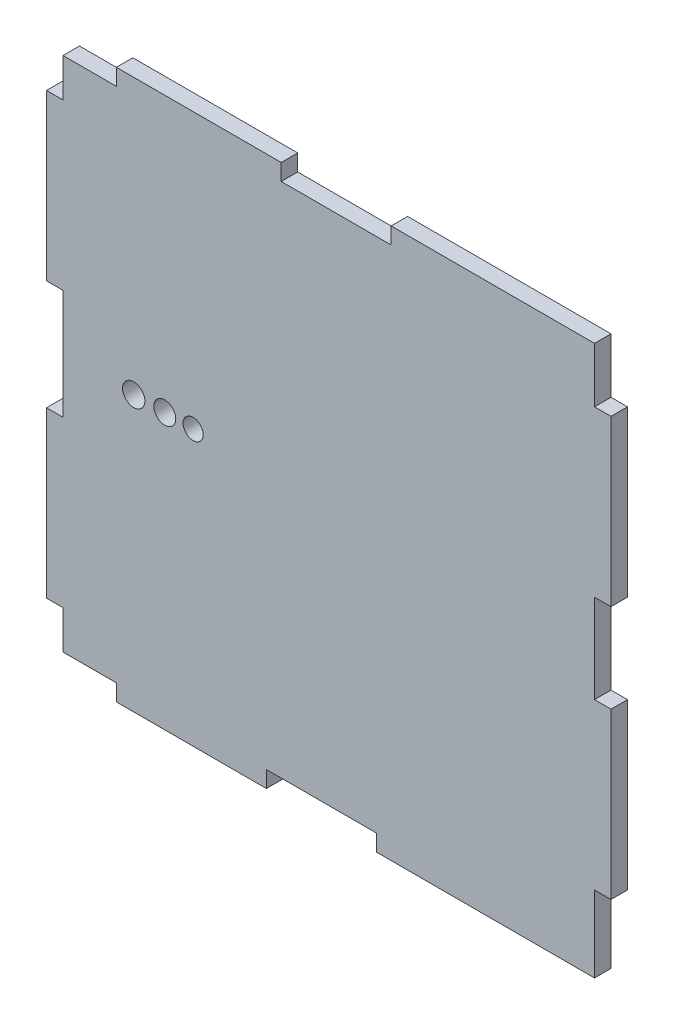
ISO-10303-21;
HEADER;
FILE_DESCRIPTION(('STEP AP214'),'2;1');
FILE_NAME('part.step','',(''),(''),'','','');
FILE_SCHEMA(('AUTOMOTIVE_DESIGN { 1 0 10303 214 1 1 1 1 }'));
ENDSEC;
DATA;
#1=APPLICATION_CONTEXT('core data for automotive mechanical design processes');
#2=APPLICATION_PROTOCOL_DEFINITION('international standard','automotive_design',2000,#1);
#3=PRODUCT_CONTEXT('',#1,'mechanical');
#4=PRODUCT('Part','Part','',(#3));
#5=PRODUCT_RELATED_PRODUCT_CATEGORY('part','',(#4));
#6=PRODUCT_DEFINITION_FORMATION('','',#4);
#7=PRODUCT_DEFINITION_CONTEXT('part definition',#1,'design');
#8=PRODUCT_DEFINITION('design','',#6,#7);
#9=PRODUCT_DEFINITION_SHAPE('','',#8);
#10=(LENGTH_UNIT() NAMED_UNIT(*) SI_UNIT(.MILLI.,.METRE.));
#11=(NAMED_UNIT(*) PLANE_ANGLE_UNIT() SI_UNIT($,.RADIAN.));
#12=(NAMED_UNIT(*) SI_UNIT($,.STERADIAN.) SOLID_ANGLE_UNIT());
#13=UNCERTAINTY_MEASURE_WITH_UNIT(LENGTH_MEASURE(1.E-05),#10,'distance_accuracy_value','');
#14=(GEOMETRIC_REPRESENTATION_CONTEXT(3) GLOBAL_UNCERTAINTY_ASSIGNED_CONTEXT((#13)) GLOBAL_UNIT_ASSIGNED_CONTEXT((#10,
#11,#12)) REPRESENTATION_CONTEXT('',''));
#15=CARTESIAN_POINT('',(0.,0.,0.));
#16=DIRECTION('',(0.,0.,1.));
#17=DIRECTION('',(1.,0.,0.));
#18=AXIS2_PLACEMENT_3D('',#15,#16,#17);
#19=CARTESIAN_POINT('',(0.,26.5860677083333,3.));
#20=DIRECTION('',(0.,1.,0.));
#21=DIRECTION('',(0.,0.,1.));
#22=AXIS2_PLACEMENT_3D('',#19,#20,#21);
#23=PLANE('',#22);
#24=DIRECTION('',(1.,0.,0.));
#25=VECTOR('',#24,1.);
#26=CARTESIAN_POINT('',(0.,26.5860677083333,0.));
#27=LINE('',#26,#25);
#28=CARTESIAN_POINT('',(-44.8181202737498,26.5860677083333,0.));
#29=VERTEX_POINT('',#28);
#30=CARTESIAN_POINT('',(-14.8181202737498,26.5860677083333,0.));
#31=VERTEX_POINT('',#30);
#32=EDGE_CURVE('E283',#29,#31,#27,.T.);
#33=ORIENTED_EDGE('',*,*,#32,.F.);
#34=DIRECTION('',(0.,0.,-1.));
#35=VECTOR('',#34,1.);
#36=CARTESIAN_POINT('',(-44.8181202737498,26.5860677083333,3.));
#37=LINE('',#36,#35);
#38=CARTESIAN_POINT('',(-44.8181202737498,26.5860677083333,3.));
#39=VERTEX_POINT('',#38);
#40=EDGE_CURVE('E11',#39,#29,#37,.T.);
#41=ORIENTED_EDGE('',*,*,#40,.F.);
#42=DIRECTION('',(1.,0.,0.));
#43=VECTOR('',#42,1.);
#44=CARTESIAN_POINT('',(0.,26.5860677083333,3.));
#45=LINE('',#44,#43);
#46=CARTESIAN_POINT('',(-14.8181202737498,26.5860677083333,3.));
#47=VERTEX_POINT('',#46);
#48=EDGE_CURVE('E463',#39,#47,#45,.T.);
#49=ORIENTED_EDGE('',*,*,#48,.T.);
#50=DIRECTION('',(0.,0.,-1.));
#51=VECTOR('',#50,1.);
#52=CARTESIAN_POINT('',(-14.8181202737498,26.5860677083333,3.));
#53=LINE('',#52,#51);
#54=EDGE_CURVE('E52',#47,#31,#53,.T.);
#55=ORIENTED_EDGE('',*,*,#54,.T.);
#56=EDGE_LOOP('',(#33,#41,#49,#55));
#57=FACE_BOUND('',#56,.T.);
#58=ADVANCED_FACE('F35',(#57),#23,.T.);
#59=CARTESIAN_POINT('',(-44.8181202737498,0.,3.));
#60=DIRECTION('',(1.,0.,0.));
#61=DIRECTION('',(0.,0.,-1.));
#62=AXIS2_PLACEMENT_3D('',#59,#60,#61);
#63=PLANE('',#62);
#64=DIRECTION('',(0.,-1.,0.));
#65=VECTOR('',#64,1.);
#66=CARTESIAN_POINT('',(-44.8181202737498,0.,0.));
#67=LINE('',#66,#65);
#68=CARTESIAN_POINT('',(-44.8181202737498,23.5860677083333,0.));
#69=VERTEX_POINT('',#68);
#70=EDGE_CURVE('E285',#29,#69,#67,.T.);
#71=ORIENTED_EDGE('',*,*,#70,.T.);
#72=DIRECTION('',(0.,0.,-1.));
#73=VECTOR('',#72,1.);
#74=CARTESIAN_POINT('',(-44.8181202737498,23.5860677083333,3.));
#75=LINE('',#74,#73);
#76=CARTESIAN_POINT('',(-44.8181202737498,23.5860677083333,3.));
#77=VERTEX_POINT('',#76);
#78=EDGE_CURVE('E44',#77,#69,#75,.T.);
#79=ORIENTED_EDGE('',*,*,#78,.F.);
#80=DIRECTION('',(0.,-1.,0.));
#81=VECTOR('',#80,1.);
#82=CARTESIAN_POINT('',(-44.8181202737498,0.,3.));
#83=LINE('',#82,#81);
#84=EDGE_CURVE('E461',#39,#77,#83,.T.);
#85=ORIENTED_EDGE('',*,*,#84,.F.);
#86=ORIENTED_EDGE('',*,*,#40,.T.);
#87=EDGE_LOOP('',(#71,#79,#85,#86));
#88=FACE_BOUND('',#87,.T.);
#89=ADVANCED_FACE('F446',(#88),#63,.F.);
#90=CARTESIAN_POINT('',(0.,23.5860677083333,3.));
#91=DIRECTION('',(0.,1.,0.));
#92=DIRECTION('',(0.,0.,1.));
#93=AXIS2_PLACEMENT_3D('',#90,#91,#92);
#94=PLANE('',#93);
#95=DIRECTION('',(1.,0.,0.));
#96=VECTOR('',#95,1.);
#97=CARTESIAN_POINT('',(0.,23.5860677083333,0.));
#98=LINE('',#97,#96);
#99=CARTESIAN_POINT('',(-54.5181202737498,23.5860677083333,0.));
#100=VERTEX_POINT('',#99);
#101=EDGE_CURVE('E288',#100,#69,#98,.T.);
#102=ORIENTED_EDGE('',*,*,#101,.F.);
#103=DIRECTION('',(0.,0.,-1.));
#104=VECTOR('',#103,1.);
#105=CARTESIAN_POINT('',(-54.5181202737498,23.5860677083333,3.));
#106=LINE('',#105,#104);
#107=CARTESIAN_POINT('',(-54.5181202737498,23.5860677083333,3.));
#108=VERTEX_POINT('',#107);
#109=EDGE_CURVE('E436',#108,#100,#106,.T.);
#110=ORIENTED_EDGE('',*,*,#109,.F.);
#111=DIRECTION('',(1.,0.,0.));
#112=VECTOR('',#111,1.);
#113=CARTESIAN_POINT('',(0.,23.5860677083333,3.));
#114=LINE('',#113,#112);
#115=EDGE_CURVE('E443',#108,#77,#114,.T.);
#116=ORIENTED_EDGE('',*,*,#115,.T.);
#117=ORIENTED_EDGE('',*,*,#78,.T.);
#118=EDGE_LOOP('',(#102,#110,#116,#117));
#119=FACE_BOUND('',#118,.T.);
#120=ADVANCED_FACE('F441',(#119),#94,.T.);
#121=CARTESIAN_POINT('',(-54.5181202737498,0.,3.));
#122=DIRECTION('',(1.,0.,0.));
#123=DIRECTION('',(0.,0.,-1.));
#124=AXIS2_PLACEMENT_3D('',#121,#122,#123);
#125=PLANE('',#124);
#126=DIRECTION('',(0.,-1.,0.));
#127=VECTOR('',#126,1.);
#128=CARTESIAN_POINT('',(-54.5181202737498,0.,0.));
#129=LINE('',#128,#127);
#130=CARTESIAN_POINT('',(-54.5181202737498,16.5860677083333,0.));
#131=VERTEX_POINT('',#130);
#132=EDGE_CURVE('E291',#100,#131,#129,.T.);
#133=ORIENTED_EDGE('',*,*,#132,.T.);
#134=DIRECTION('',(0.,0.,-1.));
#135=VECTOR('',#134,1.);
#136=CARTESIAN_POINT('',(-54.5181202737498,16.5860677083333,3.));
#137=LINE('',#136,#135);
#138=CARTESIAN_POINT('',(-54.5181202737498,16.5860677083333,3.));
#139=VERTEX_POINT('',#138);
#140=EDGE_CURVE('E434',#139,#131,#137,.T.);
#141=ORIENTED_EDGE('',*,*,#140,.F.);
#142=DIRECTION('',(0.,-1.,0.));
#143=VECTOR('',#142,1.);
#144=CARTESIAN_POINT('',(-54.5181202737498,0.,3.));
#145=LINE('',#144,#143);
#146=EDGE_CURVE('E457',#108,#139,#145,.T.);
#147=ORIENTED_EDGE('',*,*,#146,.F.);
#148=ORIENTED_EDGE('',*,*,#109,.T.);
#149=EDGE_LOOP('',(#133,#141,#147,#148));
#150=FACE_BOUND('',#149,.T.);
#151=ADVANCED_FACE('F454',(#150),#125,.F.);
#152=CARTESIAN_POINT('',(0.,16.5860677083333,3.));
#153=DIRECTION('',(0.,1.,0.));
#154=DIRECTION('',(0.,0.,1.));
#155=AXIS2_PLACEMENT_3D('',#152,#153,#154);
#156=PLANE('',#155);
#157=DIRECTION('',(1.,0.,0.));
#158=VECTOR('',#157,1.);
#159=CARTESIAN_POINT('',(0.,16.5860677083333,0.));
#160=LINE('',#159,#158);
#161=CARTESIAN_POINT('',(-57.5181202737498,16.5860677083333,0.));
#162=VERTEX_POINT('',#161);
#163=EDGE_CURVE('E294',#162,#131,#160,.T.);
#164=ORIENTED_EDGE('',*,*,#163,.F.);
#165=DIRECTION('',(0.,0.,-1.));
#166=VECTOR('',#165,1.);
#167=CARTESIAN_POINT('',(-57.5181202737498,16.5860677083333,3.));
#168=LINE('',#167,#166);
#169=CARTESIAN_POINT('',(-57.5181202737498,16.5860677083333,3.));
#170=VERTEX_POINT('',#169);
#171=EDGE_CURVE('E432',#170,#162,#168,.T.);
#172=ORIENTED_EDGE('',*,*,#171,.F.);
#173=DIRECTION('',(1.,0.,0.));
#174=VECTOR('',#173,1.);
#175=CARTESIAN_POINT('',(0.,16.5860677083333,3.));
#176=LINE('',#175,#174);
#177=EDGE_CURVE('E459',#170,#139,#176,.T.);
#178=ORIENTED_EDGE('',*,*,#177,.T.);
#179=ORIENTED_EDGE('',*,*,#140,.T.);
#180=EDGE_LOOP('',(#164,#172,#178,#179));
#181=FACE_BOUND('',#180,.T.);
#182=ADVANCED_FACE('F860',(#181),#156,.T.);
#183=CARTESIAN_POINT('',(-57.5181202737498,0.,3.));
#184=DIRECTION('',(1.,0.,0.));
#185=DIRECTION('',(0.,1.,0.));
#186=AXIS2_PLACEMENT_3D('',#183,#184,#185);
#187=PLANE('',#186);
#188=DIRECTION('',(0.,-1.,0.));
#189=VECTOR('',#188,1.);
#190=CARTESIAN_POINT('',(-57.5181202737498,0.,0.));
#191=LINE('',#190,#189);
#192=CARTESIAN_POINT('',(-57.5181202737498,-13.4139322916667,0.));
#193=VERTEX_POINT('',#192);
#194=EDGE_CURVE('E297',#162,#193,#191,.T.);
#195=ORIENTED_EDGE('',*,*,#194,.T.);
#196=DIRECTION('',(0.,0.,-1.));
#197=VECTOR('',#196,1.);
#198=CARTESIAN_POINT('',(-57.5181202737498,-13.4139322916667,3.));
#199=LINE('',#198,#197);
#200=CARTESIAN_POINT('',(-57.5181202737498,-13.4139322916667,3.));
#201=VERTEX_POINT('',#200);
#202=EDGE_CURVE('E430',#201,#193,#199,.T.);
#203=ORIENTED_EDGE('',*,*,#202,.F.);
#204=DIRECTION('',(0.,-1.,0.));
#205=VECTOR('',#204,1.);
#206=CARTESIAN_POINT('',(-57.5181202737498,0.,3.));
#207=LINE('',#206,#205);
#208=EDGE_CURVE('E468',#170,#201,#207,.T.);
#209=ORIENTED_EDGE('',*,*,#208,.F.);
#210=ORIENTED_EDGE('',*,*,#171,.T.);
#211=EDGE_LOOP('',(#195,#203,#209,#210));
#212=FACE_BOUND('',#211,.T.);
#213=ADVANCED_FACE('F850',(#212),#187,.F.);
#214=CARTESIAN_POINT('',(0.,-13.4139322916667,3.));
#215=DIRECTION('',(0.,-1.,0.));
#216=DIRECTION('',(0.,0.,-1.));
#217=AXIS2_PLACEMENT_3D('',#214,#215,#216);
#218=PLANE('',#217);
#219=DIRECTION('',(-1.,0.,0.));
#220=VECTOR('',#219,1.);
#221=CARTESIAN_POINT('',(0.,-13.4139322916667,0.));
#222=LINE('',#221,#220);
#223=CARTESIAN_POINT('',(-54.5181202737498,-13.4139322916667,0.));
#224=VERTEX_POINT('',#223);
#225=EDGE_CURVE('E300',#224,#193,#222,.T.);
#226=ORIENTED_EDGE('',*,*,#225,.F.);
#227=DIRECTION('',(0.,0.,-1.));
#228=VECTOR('',#227,1.);
#229=CARTESIAN_POINT('',(-54.5181202737498,-13.4139322916667,3.));
#230=LINE('',#229,#228);
#231=CARTESIAN_POINT('',(-54.5181202737498,-13.4139322916667,3.));
#232=VERTEX_POINT('',#231);
#233=EDGE_CURVE('E428',#232,#224,#230,.T.);
#234=ORIENTED_EDGE('',*,*,#233,.F.);
#235=DIRECTION('',(-1.,0.,0.));
#236=VECTOR('',#235,1.);
#237=CARTESIAN_POINT('',(0.,-13.4139322916667,3.));
#238=LINE('',#237,#236);
#239=EDGE_CURVE('E470',#232,#201,#238,.T.);
#240=ORIENTED_EDGE('',*,*,#239,.T.);
#241=ORIENTED_EDGE('',*,*,#202,.T.);
#242=EDGE_LOOP('',(#226,#234,#240,#241));
#243=FACE_BOUND('',#242,.T.);
#244=ADVANCED_FACE('F840',(#243),#218,.T.);
#245=CARTESIAN_POINT('',(-54.5181202737498,0.,3.));
#246=DIRECTION('',(1.,0.,0.));
#247=DIRECTION('',(0.,0.,-1.));
#248=AXIS2_PLACEMENT_3D('',#245,#246,#247);
#249=PLANE('',#248);
#250=DIRECTION('',(0.,-1.,0.));
#251=VECTOR('',#250,1.);
#252=CARTESIAN_POINT('',(-54.5181202737498,0.,0.));
#253=LINE('',#252,#251);
#254=CARTESIAN_POINT('',(-54.5181202737498,-33.4139322916667,0.));
#255=VERTEX_POINT('',#254);
#256=EDGE_CURVE('E303',#224,#255,#253,.T.);
#257=ORIENTED_EDGE('',*,*,#256,.T.);
#258=DIRECTION('',(0.,0.,-1.));
#259=VECTOR('',#258,1.);
#260=CARTESIAN_POINT('',(-54.5181202737498,-33.4139322916667,3.));
#261=LINE('',#260,#259);
#262=CARTESIAN_POINT('',(-54.5181202737498,-33.4139322916667,3.));
#263=VERTEX_POINT('',#262);
#264=EDGE_CURVE('E425',#263,#255,#261,.T.);
#265=ORIENTED_EDGE('',*,*,#264,.F.);
#266=DIRECTION('',(0.,-1.,0.));
#267=VECTOR('',#266,1.);
#268=CARTESIAN_POINT('',(-54.5181202737498,0.,3.));
#269=LINE('',#268,#267);
#270=EDGE_CURVE('E473',#232,#263,#269,.T.);
#271=ORIENTED_EDGE('',*,*,#270,.F.);
#272=ORIENTED_EDGE('',*,*,#233,.T.);
#273=EDGE_LOOP('',(#257,#265,#271,#272));
#274=FACE_BOUND('',#273,.T.);
#275=ADVANCED_FACE('F830',(#274),#249,.F.);
#276=CARTESIAN_POINT('',(0.,-33.4139322916667,3.));
#277=DIRECTION('',(0.,-1.,0.));
#278=DIRECTION('',(0.,0.,-1.));
#279=AXIS2_PLACEMENT_3D('',#276,#277,#278);
#280=PLANE('',#279);
#281=DIRECTION('',(-1.,0.,0.));
#282=VECTOR('',#281,1.);
#283=CARTESIAN_POINT('',(0.,-33.4139322916667,0.));
#284=LINE('',#283,#282);
#285=CARTESIAN_POINT('',(-57.5181202737498,-33.4139322916667,0.));
#286=VERTEX_POINT('',#285);
#287=EDGE_CURVE('E306',#255,#286,#284,.T.);
#288=ORIENTED_EDGE('',*,*,#287,.T.);
#289=DIRECTION('',(0.,0.,-1.));
#290=VECTOR('',#289,1.);
#291=CARTESIAN_POINT('',(-57.5181202737498,-33.4139322916667,3.));
#292=LINE('',#291,#290);
#293=CARTESIAN_POINT('',(-57.5181202737498,-33.4139322916667,3.));
#294=VERTEX_POINT('',#293);
#295=EDGE_CURVE('E422',#294,#286,#292,.T.);
#296=ORIENTED_EDGE('',*,*,#295,.F.);
#297=DIRECTION('',(-1.,0.,0.));
#298=VECTOR('',#297,1.);
#299=CARTESIAN_POINT('',(0.,-33.4139322916667,3.));
#300=LINE('',#299,#298);
#301=EDGE_CURVE('E476',#263,#294,#300,.T.);
#302=ORIENTED_EDGE('',*,*,#301,.F.);
#303=ORIENTED_EDGE('',*,*,#264,.T.);
#304=EDGE_LOOP('',(#288,#296,#302,#303));
#305=FACE_BOUND('',#304,.T.);
#306=ADVANCED_FACE('F820',(#305),#280,.F.);
#307=CARTESIAN_POINT('',(-57.5181202737498,0.,3.));
#308=DIRECTION('',(1.,0.,0.));
#309=DIRECTION('',(0.,1.,0.));
#310=AXIS2_PLACEMENT_3D('',#307,#308,#309);
#311=PLANE('',#310);
#312=DIRECTION('',(0.,-1.,0.));
#313=VECTOR('',#312,1.);
#314=CARTESIAN_POINT('',(-57.5181202737498,0.,0.));
#315=LINE('',#314,#313);
#316=CARTESIAN_POINT('',(-57.5181202737497,-63.4139322916667,0.));
#317=VERTEX_POINT('',#316);
#318=EDGE_CURVE('E309',#286,#317,#315,.T.);
#319=ORIENTED_EDGE('',*,*,#318,.T.);
#320=DIRECTION('',(0.,0.,-1.));
#321=VECTOR('',#320,1.);
#322=CARTESIAN_POINT('',(-57.5181202737497,-63.4139322916667,3.));
#323=LINE('',#322,#321);
#324=CARTESIAN_POINT('',(-57.5181202737497,-63.4139322916667,3.));
#325=VERTEX_POINT('',#324);
#326=EDGE_CURVE('E419',#325,#317,#323,.T.);
#327=ORIENTED_EDGE('',*,*,#326,.F.);
#328=DIRECTION('',(0.,-1.,0.));
#329=VECTOR('',#328,1.);
#330=CARTESIAN_POINT('',(-57.5181202737498,0.,3.));
#331=LINE('',#330,#329);
#332=EDGE_CURVE('E479',#294,#325,#331,.T.);
#333=ORIENTED_EDGE('',*,*,#332,.F.);
#334=ORIENTED_EDGE('',*,*,#295,.T.);
#335=EDGE_LOOP('',(#319,#327,#333,#334));
#336=FACE_BOUND('',#335,.T.);
#337=ADVANCED_FACE('F810',(#336),#311,.F.);
#338=CARTESIAN_POINT('',(0.,-63.4139322916667,3.));
#339=DIRECTION('',(0.,1.,0.));
#340=DIRECTION('',(0.,0.,1.));
#341=AXIS2_PLACEMENT_3D('',#338,#339,#340);
#342=PLANE('',#341);
#343=DIRECTION('',(1.,0.,0.));
#344=VECTOR('',#343,1.);
#345=CARTESIAN_POINT('',(0.,-63.4139322916667,0.));
#346=LINE('',#345,#344);
#347=CARTESIAN_POINT('',(-54.5181202737497,-63.4139322916667,0.));
#348=VERTEX_POINT('',#347);
#349=EDGE_CURVE('E312',#317,#348,#346,.T.);
#350=ORIENTED_EDGE('',*,*,#349,.T.);
#351=DIRECTION('',(0.,0.,-1.));
#352=VECTOR('',#351,1.);
#353=CARTESIAN_POINT('',(-54.5181202737497,-63.4139322916667,3.));
#354=LINE('',#353,#352);
#355=CARTESIAN_POINT('',(-54.5181202737497,-63.4139322916667,3.));
#356=VERTEX_POINT('',#355);
#357=EDGE_CURVE('E417',#356,#348,#354,.T.);
#358=ORIENTED_EDGE('',*,*,#357,.F.);
#359=DIRECTION('',(1.,0.,0.));
#360=VECTOR('',#359,1.);
#361=CARTESIAN_POINT('',(0.,-63.4139322916667,3.));
#362=LINE('',#361,#360);
#363=EDGE_CURVE('E482',#325,#356,#362,.T.);
#364=ORIENTED_EDGE('',*,*,#363,.F.);
#365=ORIENTED_EDGE('',*,*,#326,.T.);
#366=EDGE_LOOP('',(#350,#358,#364,#365));
#367=FACE_BOUND('',#366,.T.);
#368=ADVANCED_FACE('F800',(#367),#342,.F.);
#369=CARTESIAN_POINT('',(-54.5181202737498,0.,3.));
#370=DIRECTION('',(-1.,0.,0.));
#371=DIRECTION('',(0.,-1.,0.));
#372=AXIS2_PLACEMENT_3D('',#369,#370,#371);
#373=PLANE('',#372);
#374=DIRECTION('',(0.,1.,0.));
#375=VECTOR('',#374,1.);
#376=CARTESIAN_POINT('',(-54.5181202737498,0.,0.));
#377=LINE('',#376,#375);
#378=CARTESIAN_POINT('',(-54.5181202737497,-70.4139322916667,0.));
#379=VERTEX_POINT('',#378);
#380=EDGE_CURVE('E315',#379,#348,#377,.T.);
#381=ORIENTED_EDGE('',*,*,#380,.F.);
#382=DIRECTION('',(0.,0.,-1.));
#383=VECTOR('',#382,1.);
#384=CARTESIAN_POINT('',(-54.5181202737497,-70.4139322916667,3.));
#385=LINE('',#384,#383);
#386=CARTESIAN_POINT('',(-54.5181202737497,-70.4139322916667,3.));
#387=VERTEX_POINT('',#386);
#388=EDGE_CURVE('E415',#387,#379,#385,.T.);
#389=ORIENTED_EDGE('',*,*,#388,.F.);
#390=DIRECTION('',(0.,1.,0.));
#391=VECTOR('',#390,1.);
#392=CARTESIAN_POINT('',(-54.5181202737498,0.,3.));
#393=LINE('',#392,#391);
#394=EDGE_CURVE('E484',#387,#356,#393,.T.);
#395=ORIENTED_EDGE('',*,*,#394,.T.);
#396=ORIENTED_EDGE('',*,*,#357,.T.);
#397=EDGE_LOOP('',(#381,#389,#395,#396));
#398=FACE_BOUND('',#397,.T.);
#399=ADVANCED_FACE('F790',(#398),#373,.T.);
#400=CARTESIAN_POINT('',(0.,-70.4139322916667,3.));
#401=DIRECTION('',(0.,1.,0.));
#402=DIRECTION('',(0.,0.,1.));
#403=AXIS2_PLACEMENT_3D('',#400,#401,#402);
#404=PLANE('',#403);
#405=DIRECTION('',(1.,0.,0.));
#406=VECTOR('',#405,1.);
#407=CARTESIAN_POINT('',(0.,-70.4139322916667,0.));
#408=LINE('',#407,#406);
#409=CARTESIAN_POINT('',(-44.8181202737497,-70.4139322916667,0.));
#410=VERTEX_POINT('',#409);
#411=EDGE_CURVE('E318',#379,#410,#408,.T.);
#412=ORIENTED_EDGE('',*,*,#411,.T.);
#413=DIRECTION('',(0.,0.,-1.));
#414=VECTOR('',#413,1.);
#415=CARTESIAN_POINT('',(-44.8181202737497,-70.4139322916667,3.));
#416=LINE('',#415,#414);
#417=CARTESIAN_POINT('',(-44.8181202737497,-70.4139322916667,3.));
#418=VERTEX_POINT('',#417);
#419=EDGE_CURVE('E412',#418,#410,#416,.T.);
#420=ORIENTED_EDGE('',*,*,#419,.F.);
#421=DIRECTION('',(1.,0.,0.));
#422=VECTOR('',#421,1.);
#423=CARTESIAN_POINT('',(0.,-70.4139322916667,3.));
#424=LINE('',#423,#422);
#425=EDGE_CURVE('E487',#387,#418,#424,.T.);
#426=ORIENTED_EDGE('',*,*,#425,.F.);
#427=ORIENTED_EDGE('',*,*,#388,.T.);
#428=EDGE_LOOP('',(#412,#420,#426,#427));
#429=FACE_BOUND('',#428,.T.);
#430=ADVANCED_FACE('F779',(#429),#404,.F.);
#431=CARTESIAN_POINT('',(-44.8181202737497,0.,3.));
#432=DIRECTION('',(1.,0.,0.));
#433=DIRECTION('',(0.,0.,-1.));
#434=AXIS2_PLACEMENT_3D('',#431,#432,#433);
#435=PLANE('',#434);
#436=DIRECTION('',(0.,-1.,0.));
#437=VECTOR('',#436,1.);
#438=CARTESIAN_POINT('',(-44.8181202737497,0.,0.));
#439=LINE('',#438,#437);
#440=CARTESIAN_POINT('',(-44.8181202737497,-73.4139322916667,0.));
#441=VERTEX_POINT('',#440);
#442=EDGE_CURVE('E321',#410,#441,#439,.T.);
#443=ORIENTED_EDGE('',*,*,#442,.T.);
#444=DIRECTION('',(0.,0.,-1.));
#445=VECTOR('',#444,1.);
#446=CARTESIAN_POINT('',(-44.8181202737497,-73.4139322916667,3.));
#447=LINE('',#446,#445);
#448=CARTESIAN_POINT('',(-44.8181202737497,-73.4139322916667,3.));
#449=VERTEX_POINT('',#448);
#450=EDGE_CURVE('E409',#449,#441,#447,.T.);
#451=ORIENTED_EDGE('',*,*,#450,.F.);
#452=DIRECTION('',(0.,-1.,0.));
#453=VECTOR('',#452,1.);
#454=CARTESIAN_POINT('',(-44.8181202737497,0.,3.));
#455=LINE('',#454,#453);
#456=EDGE_CURVE('E490',#418,#449,#455,.T.);
#457=ORIENTED_EDGE('',*,*,#456,.F.);
#458=ORIENTED_EDGE('',*,*,#419,.T.);
#459=EDGE_LOOP('',(#443,#451,#457,#458));
#460=FACE_BOUND('',#459,.T.);
#461=ADVANCED_FACE('F768',(#460),#435,.F.);
#462=CARTESIAN_POINT('',(0.,-73.4139322916667,3.));
#463=DIRECTION('',(0.,1.,0.));
#464=DIRECTION('',(0.,0.,1.));
#465=AXIS2_PLACEMENT_3D('',#462,#463,#464);
#466=PLANE('',#465);
#467=DIRECTION('',(1.,0.,0.));
#468=VECTOR('',#467,1.);
#469=CARTESIAN_POINT('',(0.,-73.4139322916667,0.));
#470=LINE('',#469,#468);
#471=CARTESIAN_POINT('',(-17.5181202737498,-73.4139322916667,0.));
#472=VERTEX_POINT('',#471);
#473=EDGE_CURVE('E324',#441,#472,#470,.T.);
#474=ORIENTED_EDGE('',*,*,#473,.T.);
#475=DIRECTION('',(0.,0.,-1.));
#476=VECTOR('',#475,1.);
#477=CARTESIAN_POINT('',(-17.5181202737498,-73.4139322916667,3.));
#478=LINE('',#477,#476);
#479=CARTESIAN_POINT('',(-17.5181202737498,-73.4139322916667,3.));
#480=VERTEX_POINT('',#479);
#481=EDGE_CURVE('E406',#480,#472,#478,.T.);
#482=ORIENTED_EDGE('',*,*,#481,.F.);
#483=DIRECTION('',(1.,0.,0.));
#484=VECTOR('',#483,1.);
#485=CARTESIAN_POINT('',(0.,-73.4139322916667,3.));
#486=LINE('',#485,#484);
#487=EDGE_CURVE('E493',#449,#480,#486,.T.);
#488=ORIENTED_EDGE('',*,*,#487,.F.);
#489=ORIENTED_EDGE('',*,*,#450,.T.);
#490=EDGE_LOOP('',(#474,#482,#488,#489));
#491=FACE_BOUND('',#490,.T.);
#492=ADVANCED_FACE('F758',(#491),#466,.F.);
#493=CARTESIAN_POINT('',(-17.5181202737498,0.,3.));
#494=DIRECTION('',(-1.,0.,0.));
#495=DIRECTION('',(0.,0.,1.));
#496=AXIS2_PLACEMENT_3D('',#493,#494,#495);
#497=PLANE('',#496);
#498=DIRECTION('',(0.,1.,0.));
#499=VECTOR('',#498,1.);
#500=CARTESIAN_POINT('',(-17.5181202737498,0.,0.));
#501=LINE('',#500,#499);
#502=CARTESIAN_POINT('',(-17.5181202737498,-70.4139322916667,0.));
#503=VERTEX_POINT('',#502);
#504=EDGE_CURVE('E327',#472,#503,#501,.T.);
#505=ORIENTED_EDGE('',*,*,#504,.T.);
#506=DIRECTION('',(0.,0.,-1.));
#507=VECTOR('',#506,1.);
#508=CARTESIAN_POINT('',(-17.5181202737498,-70.4139322916667,3.));
#509=LINE('',#508,#507);
#510=CARTESIAN_POINT('',(-17.5181202737498,-70.4139322916667,3.));
#511=VERTEX_POINT('',#510);
#512=EDGE_CURVE('E403',#511,#503,#509,.T.);
#513=ORIENTED_EDGE('',*,*,#512,.F.);
#514=DIRECTION('',(0.,1.,0.));
#515=VECTOR('',#514,1.);
#516=CARTESIAN_POINT('',(-17.5181202737498,0.,3.));
#517=LINE('',#516,#515);
#518=EDGE_CURVE('E496',#480,#511,#517,.T.);
#519=ORIENTED_EDGE('',*,*,#518,.F.);
#520=ORIENTED_EDGE('',*,*,#481,.T.);
#521=EDGE_LOOP('',(#505,#513,#519,#520));
#522=FACE_BOUND('',#521,.T.);
#523=ADVANCED_FACE('F748',(#522),#497,.F.);
#524=CARTESIAN_POINT('',(0.,-70.4139322916667,3.));
#525=DIRECTION('',(0.,1.,0.));
#526=DIRECTION('',(0.,0.,1.));
#527=AXIS2_PLACEMENT_3D('',#524,#525,#526);
#528=PLANE('',#527);
#529=DIRECTION('',(1.,0.,0.));
#530=VECTOR('',#529,1.);
#531=CARTESIAN_POINT('',(0.,-70.4139322916667,0.));
#532=LINE('',#531,#530);
#533=CARTESIAN_POINT('',(2.48187972625024,-70.4139322916667,0.));
#534=VERTEX_POINT('',#533);
#535=EDGE_CURVE('E330',#503,#534,#532,.T.);
#536=ORIENTED_EDGE('',*,*,#535,.T.);
#537=DIRECTION('',(0.,0.,-1.));
#538=VECTOR('',#537,1.);
#539=CARTESIAN_POINT('',(2.48187972625024,-70.4139322916667,3.));
#540=LINE('',#539,#538);
#541=CARTESIAN_POINT('',(2.48187972625024,-70.4139322916667,3.));
#542=VERTEX_POINT('',#541);
#543=EDGE_CURVE('E401',#542,#534,#540,.T.);
#544=ORIENTED_EDGE('',*,*,#543,.F.);
#545=DIRECTION('',(1.,0.,0.));
#546=VECTOR('',#545,1.);
#547=CARTESIAN_POINT('',(0.,-70.4139322916667,3.));
#548=LINE('',#547,#546);
#549=EDGE_CURVE('E499',#511,#542,#548,.T.);
#550=ORIENTED_EDGE('',*,*,#549,.F.);
#551=ORIENTED_EDGE('',*,*,#512,.T.);
#552=EDGE_LOOP('',(#536,#544,#550,#551));
#553=FACE_BOUND('',#552,.T.);
#554=ADVANCED_FACE('F737',(#553),#528,.F.);
#555=CARTESIAN_POINT('',(2.48187972625023,0.,3.));
#556=DIRECTION('',(-1.,0.,0.));
#557=DIRECTION('',(0.,-1.,0.));
#558=AXIS2_PLACEMENT_3D('',#555,#556,#557);
#559=PLANE('',#558);
#560=DIRECTION('',(0.,1.,0.));
#561=VECTOR('',#560,1.);
#562=CARTESIAN_POINT('',(2.48187972625023,0.,0.));
#563=LINE('',#562,#561);
#564=CARTESIAN_POINT('',(2.48187972625024,-73.4139322916667,0.));
#565=VERTEX_POINT('',#564);
#566=EDGE_CURVE('E333',#565,#534,#563,.T.);
#567=ORIENTED_EDGE('',*,*,#566,.F.);
#568=DIRECTION('',(0.,0.,-1.));
#569=VECTOR('',#568,1.);
#570=CARTESIAN_POINT('',(2.48187972625024,-73.4139322916667,3.));
#571=LINE('',#570,#569);
#572=CARTESIAN_POINT('',(2.48187972625024,-73.4139322916667,3.));
#573=VERTEX_POINT('',#572);
#574=EDGE_CURVE('E399',#573,#565,#571,.T.);
#575=ORIENTED_EDGE('',*,*,#574,.F.);
#576=DIRECTION('',(0.,1.,0.));
#577=VECTOR('',#576,1.);
#578=CARTESIAN_POINT('',(2.48187972625023,0.,3.));
#579=LINE('',#578,#577);
#580=EDGE_CURVE('E501',#573,#542,#579,.T.);
#581=ORIENTED_EDGE('',*,*,#580,.T.);
#582=ORIENTED_EDGE('',*,*,#543,.T.);
#583=EDGE_LOOP('',(#567,#575,#581,#582));
#584=FACE_BOUND('',#583,.T.);
#585=ADVANCED_FACE('F726',(#584),#559,.T.);
#586=CARTESIAN_POINT('',(0.,-73.4139322916667,3.));
#587=DIRECTION('',(0.,-1.,0.));
#588=DIRECTION('',(1.,0.,0.));
#589=AXIS2_PLACEMENT_3D('',#586,#587,#588);
#590=PLANE('',#589);
#591=DIRECTION('',(-1.,0.,0.));
#592=VECTOR('',#591,1.);
#593=CARTESIAN_POINT('',(0.,-73.4139322916667,0.));
#594=LINE('',#593,#592);
#595=CARTESIAN_POINT('',(42.1818797262503,-73.4139322916667,0.));
#596=VERTEX_POINT('',#595);
#597=EDGE_CURVE('E336',#596,#565,#594,.T.);
#598=ORIENTED_EDGE('',*,*,#597,.F.);
#599=DIRECTION('',(0.,0.,-1.));
#600=VECTOR('',#599,1.);
#601=CARTESIAN_POINT('',(42.1818797262503,-73.4139322916667,3.));
#602=LINE('',#601,#600);
#603=CARTESIAN_POINT('',(42.1818797262503,-73.4139322916667,3.));
#604=VERTEX_POINT('',#603);
#605=EDGE_CURVE('E397',#604,#596,#602,.T.);
#606=ORIENTED_EDGE('',*,*,#605,.F.);
#607=DIRECTION('',(-1.,0.,0.));
#608=VECTOR('',#607,1.);
#609=CARTESIAN_POINT('',(0.,-73.4139322916667,3.));
#610=LINE('',#609,#608);
#611=EDGE_CURVE('E504',#604,#573,#610,.T.);
#612=ORIENTED_EDGE('',*,*,#611,.T.);
#613=ORIENTED_EDGE('',*,*,#574,.T.);
#614=EDGE_LOOP('',(#598,#606,#612,#613));
#615=FACE_BOUND('',#614,.T.);
#616=ADVANCED_FACE('F716',(#615),#590,.T.);
#617=CARTESIAN_POINT('',(42.1818797262503,0.,3.));
#618=DIRECTION('',(-1.,0.,0.));
#619=DIRECTION('',(0.,0.,1.));
#620=AXIS2_PLACEMENT_3D('',#617,#618,#619);
#621=PLANE('',#620);
#622=DIRECTION('',(0.,1.,0.));
#623=VECTOR('',#622,1.);
#624=CARTESIAN_POINT('',(42.1818797262503,0.,0.));
#625=LINE('',#624,#623);
#626=CARTESIAN_POINT('',(42.1818797262503,-59.5509883220698,0.));
#627=VERTEX_POINT('',#626);
#628=EDGE_CURVE('E339',#596,#627,#625,.T.);
#629=ORIENTED_EDGE('',*,*,#628,.T.);
#630=DIRECTION('',(0.,0.,-1.));
#631=VECTOR('',#630,1.);
#632=CARTESIAN_POINT('',(42.1818797262503,-59.5509883220698,3.));
#633=LINE('',#632,#631);
#634=CARTESIAN_POINT('',(42.1818797262503,-59.5509883220698,3.));
#635=VERTEX_POINT('',#634);
#636=EDGE_CURVE('E395',#635,#627,#633,.T.);
#637=ORIENTED_EDGE('',*,*,#636,.F.);
#638=DIRECTION('',(0.,1.,0.));
#639=VECTOR('',#638,1.);
#640=CARTESIAN_POINT('',(42.1818797262503,0.,3.));
#641=LINE('',#640,#639);
#642=EDGE_CURVE('E507',#604,#635,#641,.T.);
#643=ORIENTED_EDGE('',*,*,#642,.F.);
#644=ORIENTED_EDGE('',*,*,#605,.T.);
#645=EDGE_LOOP('',(#629,#637,#643,#644));
#646=FACE_BOUND('',#645,.T.);
#647=ADVANCED_FACE('F706',(#646),#621,.F.);
#648=CARTESIAN_POINT('',(0.,-59.5509883220698,3.));
#649=DIRECTION('',(0.,-1.,0.));
#650=DIRECTION('',(0.,0.,-1.));
#651=AXIS2_PLACEMENT_3D('',#648,#649,#650);
#652=PLANE('',#651);
#653=DIRECTION('',(-1.,0.,0.));
#654=VECTOR('',#653,1.);
#655=CARTESIAN_POINT('',(0.,-59.5509883220698,0.));
#656=LINE('',#655,#654);
#657=CARTESIAN_POINT('',(45.1818797262503,-59.5509883220698,0.));
#658=VERTEX_POINT('',#657);
#659=EDGE_CURVE('E342',#658,#627,#656,.T.);
#660=ORIENTED_EDGE('',*,*,#659,.F.);
#661=DIRECTION('',(0.,0.,-1.));
#662=VECTOR('',#661,1.);
#663=CARTESIAN_POINT('',(45.1818797262503,-59.5509883220698,3.));
#664=LINE('',#663,#662);
#665=CARTESIAN_POINT('',(45.1818797262503,-59.5509883220698,3.));
#666=VERTEX_POINT('',#665);
#667=EDGE_CURVE('E393',#666,#658,#664,.T.);
#668=ORIENTED_EDGE('',*,*,#667,.F.);
#669=DIRECTION('',(-1.,0.,0.));
#670=VECTOR('',#669,1.);
#671=CARTESIAN_POINT('',(0.,-59.5509883220698,3.));
#672=LINE('',#671,#670);
#673=EDGE_CURVE('E509',#666,#635,#672,.T.);
#674=ORIENTED_EDGE('',*,*,#673,.T.);
#675=ORIENTED_EDGE('',*,*,#636,.T.);
#676=EDGE_LOOP('',(#660,#668,#674,#675));
#677=FACE_BOUND('',#676,.T.);
#678=ADVANCED_FACE('F696',(#677),#652,.T.);
#679=CARTESIAN_POINT('',(45.1818797262503,0.,3.));
#680=DIRECTION('',(1.,0.,0.));
#681=DIRECTION('',(0.,0.,-1.));
#682=AXIS2_PLACEMENT_3D('',#679,#680,#681);
#683=PLANE('',#682);
#684=DIRECTION('',(0.,-1.,0.));
#685=VECTOR('',#684,1.);
#686=CARTESIAN_POINT('',(45.1818797262503,0.,0.));
#687=LINE('',#686,#685);
#688=CARTESIAN_POINT('',(45.1818797262503,-29.5509883220698,0.));
#689=VERTEX_POINT('',#688);
#690=EDGE_CURVE('E345',#689,#658,#687,.T.);
#691=ORIENTED_EDGE('',*,*,#690,.F.);
#692=DIRECTION('',(0.,0.,-1.));
#693=VECTOR('',#692,1.);
#694=CARTESIAN_POINT('',(45.1818797262503,-29.5509883220698,3.));
#695=LINE('',#694,#693);
#696=CARTESIAN_POINT('',(45.1818797262503,-29.5509883220698,3.));
#697=VERTEX_POINT('',#696);
#698=EDGE_CURVE('E391',#697,#689,#695,.T.);
#699=ORIENTED_EDGE('',*,*,#698,.F.);
#700=DIRECTION('',(0.,-1.,0.));
#701=VECTOR('',#700,1.);
#702=CARTESIAN_POINT('',(45.1818797262503,0.,3.));
#703=LINE('',#702,#701);
#704=EDGE_CURVE('E512',#697,#666,#703,.T.);
#705=ORIENTED_EDGE('',*,*,#704,.T.);
#706=ORIENTED_EDGE('',*,*,#667,.T.);
#707=EDGE_LOOP('',(#691,#699,#705,#706));
#708=FACE_BOUND('',#707,.T.);
#709=ADVANCED_FACE('F686',(#708),#683,.T.);
#710=CARTESIAN_POINT('',(0.,-29.5509883220699,3.));
#711=DIRECTION('',(0.,-1.,0.));
#712=DIRECTION('',(1.,0.,0.));
#713=AXIS2_PLACEMENT_3D('',#710,#711,#712);
#714=PLANE('',#713);
#715=DIRECTION('',(-1.,0.,0.));
#716=VECTOR('',#715,1.);
#717=CARTESIAN_POINT('',(0.,-29.5509883220699,0.));
#718=LINE('',#717,#716);
#719=CARTESIAN_POINT('',(42.1818797262503,-29.5509883220698,0.));
#720=VERTEX_POINT('',#719);
#721=EDGE_CURVE('E348',#689,#720,#718,.T.);
#722=ORIENTED_EDGE('',*,*,#721,.T.);
#723=DIRECTION('',(0.,0.,-1.));
#724=VECTOR('',#723,1.);
#725=CARTESIAN_POINT('',(42.1818797262503,-29.5509883220698,3.));
#726=LINE('',#725,#724);
#727=CARTESIAN_POINT('',(42.1818797262503,-29.5509883220698,3.));
#728=VERTEX_POINT('',#727);
#729=EDGE_CURVE('E389',#728,#720,#726,.T.);
#730=ORIENTED_EDGE('',*,*,#729,.F.);
#731=DIRECTION('',(-1.,0.,0.));
#732=VECTOR('',#731,1.);
#733=CARTESIAN_POINT('',(0.,-29.5509883220699,3.));
#734=LINE('',#733,#732);
#735=EDGE_CURVE('E515',#697,#728,#734,.T.);
#736=ORIENTED_EDGE('',*,*,#735,.F.);
#737=ORIENTED_EDGE('',*,*,#698,.T.);
#738=EDGE_LOOP('',(#722,#730,#736,#737));
#739=FACE_BOUND('',#738,.T.);
#740=ADVANCED_FACE('F676',(#739),#714,.F.);
#741=CARTESIAN_POINT('',(42.1818797262503,0.,3.));
#742=DIRECTION('',(1.,0.,0.));
#743=DIRECTION('',(0.,0.,-1.));
#744=AXIS2_PLACEMENT_3D('',#741,#742,#743);
#745=PLANE('',#744);
#746=DIRECTION('',(0.,-1.,0.));
#747=VECTOR('',#746,1.);
#748=CARTESIAN_POINT('',(42.1818797262503,0.,0.));
#749=LINE('',#748,#747);
#750=CARTESIAN_POINT('',(42.1818797262503,-13.4139322916667,0.));
#751=VERTEX_POINT('',#750);
#752=EDGE_CURVE('E351',#751,#720,#749,.T.);
#753=ORIENTED_EDGE('',*,*,#752,.F.);
#754=DIRECTION('',(0.,0.,-1.));
#755=VECTOR('',#754,1.);
#756=CARTESIAN_POINT('',(42.1818797262503,-13.4139322916667,3.));
#757=LINE('',#756,#755);
#758=CARTESIAN_POINT('',(42.1818797262503,-13.4139322916667,3.));
#759=VERTEX_POINT('',#758);
#760=EDGE_CURVE('E387',#759,#751,#757,.T.);
#761=ORIENTED_EDGE('',*,*,#760,.F.);
#762=DIRECTION('',(0.,-1.,0.));
#763=VECTOR('',#762,1.);
#764=CARTESIAN_POINT('',(42.1818797262503,0.,3.));
#765=LINE('',#764,#763);
#766=EDGE_CURVE('E517',#759,#728,#765,.T.);
#767=ORIENTED_EDGE('',*,*,#766,.T.);
#768=ORIENTED_EDGE('',*,*,#729,.T.);
#769=EDGE_LOOP('',(#753,#761,#767,#768));
#770=FACE_BOUND('',#769,.T.);
#771=ADVANCED_FACE('F666',(#770),#745,.T.);
#772=CARTESIAN_POINT('',(0.,-13.4139322916667,3.));
#773=DIRECTION('',(0.,-1.,0.));
#774=DIRECTION('',(0.,0.,-1.));
#775=AXIS2_PLACEMENT_3D('',#772,#773,#774);
#776=PLANE('',#775);
#777=DIRECTION('',(-1.,0.,0.));
#778=VECTOR('',#777,1.);
#779=CARTESIAN_POINT('',(0.,-13.4139322916667,0.));
#780=LINE('',#779,#778);
#781=CARTESIAN_POINT('',(45.1818797262503,-13.4139322916667,0.));
#782=VERTEX_POINT('',#781);
#783=EDGE_CURVE('E354',#782,#751,#780,.T.);
#784=ORIENTED_EDGE('',*,*,#783,.F.);
#785=DIRECTION('',(0.,0.,-1.));
#786=VECTOR('',#785,1.);
#787=CARTESIAN_POINT('',(45.1818797262503,-13.4139322916667,3.));
#788=LINE('',#787,#786);
#789=CARTESIAN_POINT('',(45.1818797262503,-13.4139322916667,3.));
#790=VERTEX_POINT('',#789);
#791=EDGE_CURVE('E385',#790,#782,#788,.T.);
#792=ORIENTED_EDGE('',*,*,#791,.F.);
#793=DIRECTION('',(-1.,0.,0.));
#794=VECTOR('',#793,1.);
#795=CARTESIAN_POINT('',(0.,-13.4139322916667,3.));
#796=LINE('',#795,#794);
#797=EDGE_CURVE('E520',#790,#759,#796,.T.);
#798=ORIENTED_EDGE('',*,*,#797,.T.);
#799=ORIENTED_EDGE('',*,*,#760,.T.);
#800=EDGE_LOOP('',(#784,#792,#798,#799));
#801=FACE_BOUND('',#800,.T.);
#802=ADVANCED_FACE('F656',(#801),#776,.T.);
#803=CARTESIAN_POINT('',(45.1818797262503,0.,3.));
#804=DIRECTION('',(1.,0.,0.));
#805=DIRECTION('',(0.,1.,0.));
#806=AXIS2_PLACEMENT_3D('',#803,#804,#805);
#807=PLANE('',#806);
#808=DIRECTION('',(0.,-1.,0.));
#809=VECTOR('',#808,1.);
#810=CARTESIAN_POINT('',(45.1818797262503,0.,0.));
#811=LINE('',#810,#809);
#812=CARTESIAN_POINT('',(45.1818797262503,16.5860677083333,0.));
#813=VERTEX_POINT('',#812);
#814=EDGE_CURVE('E357',#813,#782,#811,.T.);
#815=ORIENTED_EDGE('',*,*,#814,.F.);
#816=DIRECTION('',(0.,0.,-1.));
#817=VECTOR('',#816,1.);
#818=CARTESIAN_POINT('',(45.1818797262503,16.5860677083333,3.));
#819=LINE('',#818,#817);
#820=CARTESIAN_POINT('',(45.1818797262503,16.5860677083333,3.));
#821=VERTEX_POINT('',#820);
#822=EDGE_CURVE('E383',#821,#813,#819,.T.);
#823=ORIENTED_EDGE('',*,*,#822,.F.);
#824=DIRECTION('',(0.,-1.,0.));
#825=VECTOR('',#824,1.);
#826=CARTESIAN_POINT('',(45.1818797262503,0.,3.));
#827=LINE('',#826,#825);
#828=EDGE_CURVE('E523',#821,#790,#827,.T.);
#829=ORIENTED_EDGE('',*,*,#828,.T.);
#830=ORIENTED_EDGE('',*,*,#791,.T.);
#831=EDGE_LOOP('',(#815,#823,#829,#830));
#832=FACE_BOUND('',#831,.T.);
#833=ADVANCED_FACE('F646',(#832),#807,.T.);
#834=CARTESIAN_POINT('',(0.,16.5860677083333,3.));
#835=DIRECTION('',(0.,-1.,0.));
#836=DIRECTION('',(0.,0.,-1.));
#837=AXIS2_PLACEMENT_3D('',#834,#835,#836);
#838=PLANE('',#837);
#839=DIRECTION('',(-1.,0.,0.));
#840=VECTOR('',#839,1.);
#841=CARTESIAN_POINT('',(0.,16.5860677083333,0.));
#842=LINE('',#841,#840);
#843=CARTESIAN_POINT('',(42.1818797262503,16.5860677083333,0.));
#844=VERTEX_POINT('',#843);
#845=EDGE_CURVE('E360',#813,#844,#842,.T.);
#846=ORIENTED_EDGE('',*,*,#845,.T.);
#847=DIRECTION('',(0.,0.,-1.));
#848=VECTOR('',#847,1.);
#849=CARTESIAN_POINT('',(42.1818797262503,16.5860677083333,3.));
#850=LINE('',#849,#848);
#851=CARTESIAN_POINT('',(42.1818797262503,16.5860677083333,3.));
#852=VERTEX_POINT('',#851);
#853=EDGE_CURVE('E381',#852,#844,#850,.T.);
#854=ORIENTED_EDGE('',*,*,#853,.F.);
#855=DIRECTION('',(-1.,0.,0.));
#856=VECTOR('',#855,1.);
#857=CARTESIAN_POINT('',(0.,16.5860677083333,3.));
#858=LINE('',#857,#856);
#859=EDGE_CURVE('E526',#821,#852,#858,.T.);
#860=ORIENTED_EDGE('',*,*,#859,.F.);
#861=ORIENTED_EDGE('',*,*,#822,.T.);
#862=EDGE_LOOP('',(#846,#854,#860,#861));
#863=FACE_BOUND('',#862,.T.);
#864=ADVANCED_FACE('F635',(#863),#838,.F.);
#865=CARTESIAN_POINT('',(42.1818797262503,0.,3.));
#866=DIRECTION('',(1.,0.,0.));
#867=DIRECTION('',(0.,1.,0.));
#868=AXIS2_PLACEMENT_3D('',#865,#866,#867);
#869=PLANE('',#868);
#870=DIRECTION('',(0.,-1.,0.));
#871=VECTOR('',#870,1.);
#872=CARTESIAN_POINT('',(42.1818797262503,0.,0.));
#873=LINE('',#872,#871);
#874=CARTESIAN_POINT('',(42.1818797262502,26.5860677083333,0.));
#875=VERTEX_POINT('',#874);
#876=EDGE_CURVE('E363',#875,#844,#873,.T.);
#877=ORIENTED_EDGE('',*,*,#876,.F.);
#878=DIRECTION('',(0.,0.,-1.));
#879=VECTOR('',#878,1.);
#880=CARTESIAN_POINT('',(42.1818797262502,26.5860677083333,3.));
#881=LINE('',#880,#879);
#882=CARTESIAN_POINT('',(42.1818797262502,26.5860677083333,3.));
#883=VERTEX_POINT('',#882);
#884=EDGE_CURVE('E379',#883,#875,#881,.T.);
#885=ORIENTED_EDGE('',*,*,#884,.F.);
#886=DIRECTION('',(0.,-1.,0.));
#887=VECTOR('',#886,1.);
#888=CARTESIAN_POINT('',(42.1818797262503,0.,3.));
#889=LINE('',#888,#887);
#890=EDGE_CURVE('E528',#883,#852,#889,.T.);
#891=ORIENTED_EDGE('',*,*,#890,.T.);
#892=ORIENTED_EDGE('',*,*,#853,.T.);
#893=EDGE_LOOP('',(#877,#885,#891,#892));
#894=FACE_BOUND('',#893,.T.);
#895=ADVANCED_FACE('F625',(#894),#869,.T.);
#896=CARTESIAN_POINT('',(0.,26.5860677083333,3.));
#897=DIRECTION('',(0.,1.,0.));
#898=DIRECTION('',(-1.,0.,0.));
#899=AXIS2_PLACEMENT_3D('',#896,#897,#898);
#900=PLANE('',#899);
#901=DIRECTION('',(1.,0.,0.));
#902=VECTOR('',#901,1.);
#903=CARTESIAN_POINT('',(0.,26.5860677083333,0.));
#904=LINE('',#903,#902);
#905=CARTESIAN_POINT('',(5.18187972625024,26.5860677083333,0.));
#906=VERTEX_POINT('',#905);
#907=EDGE_CURVE('E366',#906,#875,#904,.T.);
#908=ORIENTED_EDGE('',*,*,#907,.F.);
#909=DIRECTION('',(0.,0.,-1.));
#910=VECTOR('',#909,1.);
#911=CARTESIAN_POINT('',(5.18187972625024,26.5860677083333,3.));
#912=LINE('',#911,#910);
#913=CARTESIAN_POINT('',(5.18187972625024,26.5860677083333,3.));
#914=VERTEX_POINT('',#913);
#915=EDGE_CURVE('E266',#914,#906,#912,.T.);
#916=ORIENTED_EDGE('',*,*,#915,.F.);
#917=DIRECTION('',(1.,0.,0.));
#918=VECTOR('',#917,1.);
#919=CARTESIAN_POINT('',(0.,26.5860677083333,3.));
#920=LINE('',#919,#918);
#921=EDGE_CURVE('E256',#914,#883,#920,.T.);
#922=ORIENTED_EDGE('',*,*,#921,.T.);
#923=ORIENTED_EDGE('',*,*,#884,.T.);
#924=EDGE_LOOP('',(#908,#916,#922,#923));
#925=FACE_BOUND('',#924,.T.);
#926=ADVANCED_FACE('F532',(#925),#900,.T.);
#927=CARTESIAN_POINT('',(5.18187972625024,0.,3.));
#928=DIRECTION('',(1.,0.,0.));
#929=DIRECTION('',(0.,0.,-1.));
#930=AXIS2_PLACEMENT_3D('',#927,#928,#929);
#931=PLANE('',#930);
#932=DIRECTION('',(0.,-1.,0.));
#933=VECTOR('',#932,1.);
#934=CARTESIAN_POINT('',(5.18187972625024,0.,0.));
#935=LINE('',#934,#933);
#936=CARTESIAN_POINT('',(5.18187972625024,23.5860677083333,0.));
#937=VERTEX_POINT('',#936);
#938=EDGE_CURVE('E263',#906,#937,#935,.T.);
#939=ORIENTED_EDGE('',*,*,#938,.T.);
#940=DIRECTION('',(0.,0.,-1.));
#941=VECTOR('',#940,1.);
#942=CARTESIAN_POINT('',(5.18187972625024,23.5860677083333,3.));
#943=LINE('',#942,#941);
#944=CARTESIAN_POINT('',(5.18187972625024,23.5860677083333,3.));
#945=VERTEX_POINT('',#944);
#946=EDGE_CURVE('E260',#945,#937,#943,.T.);
#947=ORIENTED_EDGE('',*,*,#946,.F.);
#948=DIRECTION('',(0.,-1.,0.));
#949=VECTOR('',#948,1.);
#950=CARTESIAN_POINT('',(5.18187972625024,0.,3.));
#951=LINE('',#950,#949);
#952=EDGE_CURVE('E247',#914,#945,#951,.T.);
#953=ORIENTED_EDGE('',*,*,#952,.F.);
#954=ORIENTED_EDGE('',*,*,#915,.T.);
#955=EDGE_LOOP('',(#939,#947,#953,#954));
#956=FACE_BOUND('',#955,.T.);
#957=ADVANCED_FACE('F261',(#956),#931,.F.);
#958=CARTESIAN_POINT('',(0.,23.5860677083333,3.));
#959=DIRECTION('',(0.,1.,0.));
#960=DIRECTION('',(0.,0.,1.));
#961=AXIS2_PLACEMENT_3D('',#958,#959,#960);
#962=PLANE('',#961);
#963=DIRECTION('',(1.,0.,0.));
#964=VECTOR('',#963,1.);
#965=CARTESIAN_POINT('',(0.,23.5860677083333,0.));
#966=LINE('',#965,#964);
#967=CARTESIAN_POINT('',(-14.8181202737498,23.5860677083333,0.));
#968=VERTEX_POINT('',#967);
#969=EDGE_CURVE('E370',#968,#937,#966,.T.);
#970=ORIENTED_EDGE('',*,*,#969,.F.);
#971=DIRECTION('',(0.,0.,-1.));
#972=VECTOR('',#971,1.);
#973=CARTESIAN_POINT('',(-14.8181202737498,23.5860677083333,3.));
#974=LINE('',#973,#972);
#975=CARTESIAN_POINT('',(-14.8181202737498,23.5860677083333,3.));
#976=VERTEX_POINT('',#975);
#977=EDGE_CURVE('E149',#976,#968,#974,.T.);
#978=ORIENTED_EDGE('',*,*,#977,.F.);
#979=DIRECTION('',(1.,0.,0.));
#980=VECTOR('',#979,1.);
#981=CARTESIAN_POINT('',(0.,23.5860677083333,3.));
#982=LINE('',#981,#980);
#983=EDGE_CURVE('E253',#976,#945,#982,.T.);
#984=ORIENTED_EDGE('',*,*,#983,.T.);
#985=ORIENTED_EDGE('',*,*,#946,.T.);
#986=EDGE_LOOP('',(#970,#978,#984,#985));
#987=FACE_BOUND('',#986,.T.);
#988=ADVANCED_FACE('F268',(#987),#962,.T.);
#989=CARTESIAN_POINT('',(-41.6528752694729,-23.4139322916667,3.));
#990=DIRECTION('',(0.,0.,-1.));
#991=DIRECTION('',(-1.,0.,0.));
#992=AXIS2_PLACEMENT_3D('',#989,#990,#991);
#993=CYLINDRICAL_SURFACE('',#992,2.03347228641599);
#994=CARTESIAN_POINT('',(-41.6528752694729,-23.4139322916667,3.));
#995=DIRECTION('',(0.,0.,1.));
#996=DIRECTION('',(1.,0.,0.));
#997=AXIS2_PLACEMENT_3D('',#994,#995,#996);
#998=CIRCLE('',#997,2.03347228641599);
#999=CARTESIAN_POINT('',(-39.6194029830569,-23.4139322916667,3.));
#1000=VERTEX_POINT('',#999);
#1001=EDGE_CURVE('E959',#1000,#1000,#998,.T.);
#1002=ORIENTED_EDGE('',*,*,#1001,.T.);
#1003=EDGE_LOOP('',(#1002));
#1004=FACE_BOUND('',#1003,.T.);
#1005=CARTESIAN_POINT('',(-41.6528752694729,-23.4139322916667,0.));
#1006=DIRECTION('',(0.,0.,1.));
#1007=DIRECTION('',(1.,0.,0.));
#1008=AXIS2_PLACEMENT_3D('',#1005,#1006,#1007);
#1009=CIRCLE('',#1008,2.03347228641599);
#1010=CARTESIAN_POINT('',(-39.6194029830569,-23.4139322916667,0.));
#1011=VERTEX_POINT('',#1010);
#1012=EDGE_CURVE('E280',#1011,#1011,#1009,.T.);
#1013=ORIENTED_EDGE('',*,*,#1012,.F.);
#1014=EDGE_LOOP('',(#1013));
#1015=FACE_BOUND('',#1014,.T.);
#1016=ADVANCED_FACE('F555',(#1004,#1015),#993,.F.);
#1017=CARTESIAN_POINT('',(-35.9985422377739,-23.4139322916667,3.));
#1018=DIRECTION('',(0.,0.,-1.));
#1019=DIRECTION('',(-1.,0.,0.));
#1020=AXIS2_PLACEMENT_3D('',#1017,#1018,#1019);
#1021=CYLINDRICAL_SURFACE('',#1020,1.99564695236435);
#1022=CARTESIAN_POINT('',(-35.9985422377739,-23.4139322916667,3.));
#1023=DIRECTION('',(0.,0.,1.));
#1024=DIRECTION('',(1.,0.,0.));
#1025=AXIS2_PLACEMENT_3D('',#1022,#1023,#1024);
#1026=CIRCLE('',#1025,1.99564695236435);
#1027=CARTESIAN_POINT('',(-34.0028952854096,-23.4139322916667,3.));
#1028=VERTEX_POINT('',#1027);
#1029=EDGE_CURVE('E565',#1028,#1028,#1026,.T.);
#1030=ORIENTED_EDGE('',*,*,#1029,.T.);
#1031=EDGE_LOOP('',(#1030));
#1032=FACE_BOUND('',#1031,.T.);
#1033=CARTESIAN_POINT('',(-35.9985422377739,-23.4139322916667,0.));
#1034=DIRECTION('',(0.,0.,1.));
#1035=DIRECTION('',(1.,0.,0.));
#1036=AXIS2_PLACEMENT_3D('',#1033,#1034,#1035);
#1037=CIRCLE('',#1036,1.99564695236435);
#1038=CARTESIAN_POINT('',(-34.0028952854096,-23.4139322916667,0.));
#1039=VERTEX_POINT('',#1038);
#1040=EDGE_CURVE('E277',#1039,#1039,#1037,.T.);
#1041=ORIENTED_EDGE('',*,*,#1040,.F.);
#1042=EDGE_LOOP('',(#1041));
#1043=FACE_BOUND('',#1042,.T.);
#1044=ADVANCED_FACE('F543',(#1032,#1043),#1021,.F.);
#1045=CARTESIAN_POINT('',(-30.843120944166,-23.4139322916667,3.));
#1046=DIRECTION('',(0.,0.,-1.));
#1047=DIRECTION('',(-1.,0.,0.));
#1048=AXIS2_PLACEMENT_3D('',#1045,#1046,#1047);
#1049=CYLINDRICAL_SURFACE('',#1048,1.82934303966732);
#1050=CARTESIAN_POINT('',(-30.843120944166,-23.4139322916667,3.));
#1051=DIRECTION('',(0.,0.,1.));
#1052=DIRECTION('',(1.,0.,0.));
#1053=AXIS2_PLACEMENT_3D('',#1050,#1051,#1052);
#1054=CIRCLE('',#1053,1.82934303966732);
#1055=CARTESIAN_POINT('',(-29.0137779044986,-23.4139322916667,3.));
#1056=VERTEX_POINT('',#1055);
#1057=EDGE_CURVE('E375',#1056,#1056,#1054,.T.);
#1058=ORIENTED_EDGE('',*,*,#1057,.T.);
#1059=EDGE_LOOP('',(#1058));
#1060=FACE_BOUND('',#1059,.T.);
#1061=CARTESIAN_POINT('',(-30.843120944166,-23.4139322916667,0.));
#1062=DIRECTION('',(0.,0.,1.));
#1063=DIRECTION('',(1.,0.,0.));
#1064=AXIS2_PLACEMENT_3D('',#1061,#1062,#1063);
#1065=CIRCLE('',#1064,1.82934303966732);
#1066=CARTESIAN_POINT('',(-29.0137779044986,-23.4139322916667,0.));
#1067=VERTEX_POINT('',#1066);
#1068=EDGE_CURVE('E274',#1067,#1067,#1065,.T.);
#1069=ORIENTED_EDGE('',*,*,#1068,.F.);
#1070=EDGE_LOOP('',(#1069));
#1071=FACE_BOUND('',#1070,.T.);
#1072=ADVANCED_FACE('F37',(#1060,#1071),#1049,.F.);
#1073=CARTESIAN_POINT('',(-14.8181202737498,0.,3.));
#1074=DIRECTION('',(1.,0.,0.));
#1075=DIRECTION('',(0.,0.,-1.));
#1076=AXIS2_PLACEMENT_3D('',#1073,#1074,#1075);
#1077=PLANE('',#1076);
#1078=DIRECTION('',(0.,-1.,0.));
#1079=VECTOR('',#1078,1.);
#1080=CARTESIAN_POINT('',(-14.8181202737498,0.,0.));
#1081=LINE('',#1080,#1079);
#1082=EDGE_CURVE('E372',#31,#968,#1081,.T.);
#1083=ORIENTED_EDGE('',*,*,#1082,.F.);
#1084=ORIENTED_EDGE('',*,*,#54,.F.);
#1085=DIRECTION('',(0.,-1.,0.));
#1086=VECTOR('',#1085,1.);
#1087=CARTESIAN_POINT('',(-14.8181202737498,0.,3.));
#1088=LINE('',#1087,#1086);
#1089=EDGE_CURVE('E269',#47,#976,#1088,.T.);
#1090=ORIENTED_EDGE('',*,*,#1089,.T.);
#1091=ORIENTED_EDGE('',*,*,#977,.T.);
#1092=EDGE_LOOP('',(#1083,#1084,#1090,#1091));
#1093=FACE_BOUND('',#1092,.T.);
#1094=ADVANCED_FACE('F534',(#1093),#1077,.T.);
#1095=CARTESIAN_POINT('',(0.,0.,3.));
#1096=DIRECTION('',(0.,0.,1.));
#1097=DIRECTION('',(1.,0.,0.));
#1098=AXIS2_PLACEMENT_3D('',#1095,#1096,#1097);
#1099=PLANE('',#1098);
#1100=ORIENTED_EDGE('',*,*,#1057,.F.);
#1101=EDGE_LOOP('',(#1100));
#1102=FACE_BOUND('',#1101,.T.);
#1103=ORIENTED_EDGE('',*,*,#1029,.F.);
#1104=EDGE_LOOP('',(#1103));
#1105=FACE_BOUND('',#1104,.T.);
#1106=ORIENTED_EDGE('',*,*,#1001,.F.);
#1107=EDGE_LOOP('',(#1106));
#1108=FACE_BOUND('',#1107,.T.);
#1109=ORIENTED_EDGE('',*,*,#48,.F.);
#1110=ORIENTED_EDGE('',*,*,#84,.T.);
#1111=ORIENTED_EDGE('',*,*,#115,.F.);
#1112=ORIENTED_EDGE('',*,*,#146,.T.);
#1113=ORIENTED_EDGE('',*,*,#177,.F.);
#1114=ORIENTED_EDGE('',*,*,#208,.T.);
#1115=ORIENTED_EDGE('',*,*,#239,.F.);
#1116=ORIENTED_EDGE('',*,*,#270,.T.);
#1117=ORIENTED_EDGE('',*,*,#301,.T.);
#1118=ORIENTED_EDGE('',*,*,#332,.T.);
#1119=ORIENTED_EDGE('',*,*,#363,.T.);
#1120=ORIENTED_EDGE('',*,*,#394,.F.);
#1121=ORIENTED_EDGE('',*,*,#425,.T.);
#1122=ORIENTED_EDGE('',*,*,#456,.T.);
#1123=ORIENTED_EDGE('',*,*,#487,.T.);
#1124=ORIENTED_EDGE('',*,*,#518,.T.);
#1125=ORIENTED_EDGE('',*,*,#549,.T.);
#1126=ORIENTED_EDGE('',*,*,#580,.F.);
#1127=ORIENTED_EDGE('',*,*,#611,.F.);
#1128=ORIENTED_EDGE('',*,*,#642,.T.);
#1129=ORIENTED_EDGE('',*,*,#673,.F.);
#1130=ORIENTED_EDGE('',*,*,#704,.F.);
#1131=ORIENTED_EDGE('',*,*,#735,.T.);
#1132=ORIENTED_EDGE('',*,*,#766,.F.);
#1133=ORIENTED_EDGE('',*,*,#797,.F.);
#1134=ORIENTED_EDGE('',*,*,#828,.F.);
#1135=ORIENTED_EDGE('',*,*,#859,.T.);
#1136=ORIENTED_EDGE('',*,*,#890,.F.);
#1137=ORIENTED_EDGE('',*,*,#921,.F.);
#1138=ORIENTED_EDGE('',*,*,#952,.T.);
#1139=ORIENTED_EDGE('',*,*,#983,.F.);
#1140=ORIENTED_EDGE('',*,*,#1089,.F.);
#1141=EDGE_LOOP('',(#1109,#1110,#1111,#1112,#1113,#1114,#1115,#1116,#1117,#1118,#1119,#1120,
#1121,#1122,#1123,#1124,#1125,#1126,#1127,#1128,#1129,#1130,#1131,#1132,#1133,#1134,#1135,#1136,
#1137,#1138,#1139,#1140));
#1142=FACE_BOUND('',#1141,.T.);
#1143=ADVANCED_FACE('F250',(#1102,#1105,#1108,#1142),#1099,.T.);
#1144=CARTESIAN_POINT('',(0.,0.,0.));
#1145=DIRECTION('',(0.,0.,1.));
#1146=DIRECTION('',(1.,0.,0.));
#1147=AXIS2_PLACEMENT_3D('',#1144,#1145,#1146);
#1148=PLANE('',#1147);
#1149=ORIENTED_EDGE('',*,*,#1068,.T.);
#1150=EDGE_LOOP('',(#1149));
#1151=FACE_BOUND('',#1150,.T.);
#1152=ORIENTED_EDGE('',*,*,#1040,.T.);
#1153=EDGE_LOOP('',(#1152));
#1154=FACE_BOUND('',#1153,.T.);
#1155=ORIENTED_EDGE('',*,*,#1012,.T.);
#1156=EDGE_LOOP('',(#1155));
#1157=FACE_BOUND('',#1156,.T.);
#1158=ORIENTED_EDGE('',*,*,#32,.T.);
#1159=ORIENTED_EDGE('',*,*,#1082,.T.);
#1160=ORIENTED_EDGE('',*,*,#969,.T.);
#1161=ORIENTED_EDGE('',*,*,#938,.F.);
#1162=ORIENTED_EDGE('',*,*,#907,.T.);
#1163=ORIENTED_EDGE('',*,*,#876,.T.);
#1164=ORIENTED_EDGE('',*,*,#845,.F.);
#1165=ORIENTED_EDGE('',*,*,#814,.T.);
#1166=ORIENTED_EDGE('',*,*,#783,.T.);
#1167=ORIENTED_EDGE('',*,*,#752,.T.);
#1168=ORIENTED_EDGE('',*,*,#721,.F.);
#1169=ORIENTED_EDGE('',*,*,#690,.T.);
#1170=ORIENTED_EDGE('',*,*,#659,.T.);
#1171=ORIENTED_EDGE('',*,*,#628,.F.);
#1172=ORIENTED_EDGE('',*,*,#597,.T.);
#1173=ORIENTED_EDGE('',*,*,#566,.T.);
#1174=ORIENTED_EDGE('',*,*,#535,.F.);
#1175=ORIENTED_EDGE('',*,*,#504,.F.);
#1176=ORIENTED_EDGE('',*,*,#473,.F.);
#1177=ORIENTED_EDGE('',*,*,#442,.F.);
#1178=ORIENTED_EDGE('',*,*,#411,.F.);
#1179=ORIENTED_EDGE('',*,*,#380,.T.);
#1180=ORIENTED_EDGE('',*,*,#349,.F.);
#1181=ORIENTED_EDGE('',*,*,#318,.F.);
#1182=ORIENTED_EDGE('',*,*,#287,.F.);
#1183=ORIENTED_EDGE('',*,*,#256,.F.);
#1184=ORIENTED_EDGE('',*,*,#225,.T.);
#1185=ORIENTED_EDGE('',*,*,#194,.F.);
#1186=ORIENTED_EDGE('',*,*,#163,.T.);
#1187=ORIENTED_EDGE('',*,*,#132,.F.);
#1188=ORIENTED_EDGE('',*,*,#101,.T.);
#1189=ORIENTED_EDGE('',*,*,#70,.F.);
#1190=EDGE_LOOP('',(#1158,#1159,#1160,#1161,#1162,#1163,#1164,#1165,#1166,#1167,#1168,#1169,
#1170,#1171,#1172,#1173,#1174,#1175,#1176,#1177,#1178,#1179,#1180,#1181,#1182,#1183,#1184,#1185,
#1186,#1187,#1188,#1189));
#1191=FACE_BOUND('',#1190,.T.);
#1192=ADVANCED_FACE('F449',(#1151,#1154,#1157,#1191),#1148,.F.);
#1193=CLOSED_SHELL('',(#58,#89,#120,#151,#182,#213,#244,#275,#306,#337,#368,#399,#430,#461,#492,
#523,#554,#585,#616,#647,#678,#709,#740,#771,#802,#833,#864,#895,#926,#957,#988,#1016,#1044,
#1072,#1094,#1143,#1192));
#1194=MANIFOLD_SOLID_BREP('B2',#1193);
#1195=ADVANCED_BREP_SHAPE_REPRESENTATION('',(#18,#1194),#14);
#1196=SHAPE_DEFINITION_REPRESENTATION(#9,#1195);
ENDSEC;
END-ISO-10303-21;
